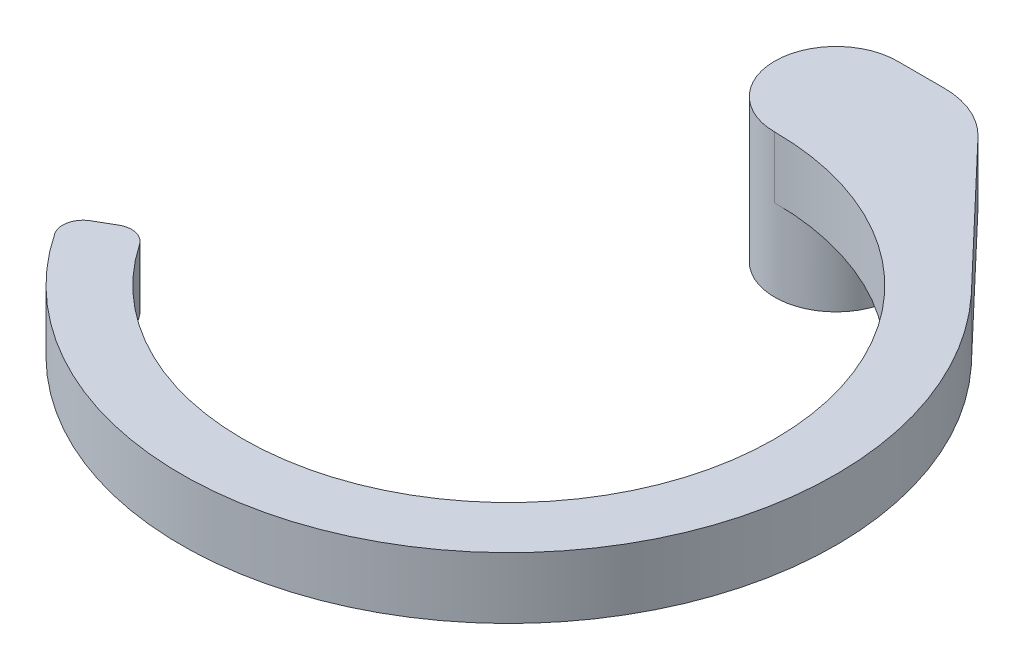
ISO-10303-21;
HEADER;
FILE_DESCRIPTION(('STEP AP214'),'2;1');
FILE_NAME('part.step','',(''),(''),'','','');
FILE_SCHEMA(('AUTOMOTIVE_DESIGN { 1 0 10303 214 1 1 1 1 }'));
ENDSEC;
DATA;
#1=APPLICATION_CONTEXT('core data for automotive mechanical design processes');
#2=APPLICATION_PROTOCOL_DEFINITION('international standard','automotive_design',2000,#1);
#3=PRODUCT_CONTEXT('',#1,'mechanical');
#4=PRODUCT('Part','Part','',(#3));
#5=PRODUCT_RELATED_PRODUCT_CATEGORY('part','',(#4));
#6=PRODUCT_DEFINITION_FORMATION('','',#4);
#7=PRODUCT_DEFINITION_CONTEXT('part definition',#1,'design');
#8=PRODUCT_DEFINITION('design','',#6,#7);
#9=PRODUCT_DEFINITION_SHAPE('','',#8);
#10=(LENGTH_UNIT() NAMED_UNIT(*) SI_UNIT(.MILLI.,.METRE.));
#11=(NAMED_UNIT(*) PLANE_ANGLE_UNIT() SI_UNIT($,.RADIAN.));
#12=(NAMED_UNIT(*) SI_UNIT($,.STERADIAN.) SOLID_ANGLE_UNIT());
#13=UNCERTAINTY_MEASURE_WITH_UNIT(LENGTH_MEASURE(1.E-05),#10,'distance_accuracy_value','');
#14=(GEOMETRIC_REPRESENTATION_CONTEXT(3) GLOBAL_UNCERTAINTY_ASSIGNED_CONTEXT((#13)) GLOBAL_UNIT_ASSIGNED_CONTEXT((#10,
#11,#12)) REPRESENTATION_CONTEXT('',''));
#15=CARTESIAN_POINT('',(0.,0.,0.));
#16=DIRECTION('',(0.,0.,1.));
#17=DIRECTION('',(1.,0.,0.));
#18=AXIS2_PLACEMENT_3D('',#15,#16,#17);
#19=CARTESIAN_POINT('',(0.,0.,0.));
#20=DIRECTION('',(0.,1.,0.));
#21=DIRECTION('',(0.,0.,1.));
#22=AXIS2_PLACEMENT_3D('',#19,#20,#21);
#23=PLANE('',#22);
#24=CARTESIAN_POINT('',(0.,0.,-80.));
#25=DIRECTION('',(0.,-1.,0.));
#26=DIRECTION('',(0.,0.,-1.));
#27=AXIS2_PLACEMENT_3D('',#24,#25,#26);
#28=CIRCLE('',#27,15.);
#29=CARTESIAN_POINT('',(0.,0.,-95.));
#30=VERTEX_POINT('',#29);
#31=CARTESIAN_POINT('',(0.,0.,-65.));
#32=VERTEX_POINT('',#31);
#33=EDGE_CURVE('E169',#30,#32,#28,.T.);
#34=ORIENTED_EDGE('',*,*,#33,.F.);
#35=DIRECTION('',(1.,0.,0.));
#36=VECTOR('',#35,1.);
#37=CARTESIAN_POINT('',(-1.15370923512719E-13,0.,-95.));
#38=LINE('',#37,#36);
#39=CARTESIAN_POINT('',(11.4274013035618,0.,-95.));
#40=VERTEX_POINT('',#39);
#41=EDGE_CURVE('E152',#30,#40,#38,.T.);
#42=ORIENTED_EDGE('',*,*,#41,.T.);
#43=CARTESIAN_POINT('',(11.4274013035615,0.,-75.));
#44=DIRECTION('',(0.,1.,0.));
#45=DIRECTION('',(0.,0.,1.));
#46=AXIS2_PLACEMENT_3D('',#43,#44,#45);
#47=CIRCLE('',#46,20.0000000000001);
#48=CARTESIAN_POINT('',(25.911523347206,0.,-88.7916717124799));
#49=VERTEX_POINT('',#48);
#50=EDGE_CURVE('E149',#40,#49,#47,.F.);
#51=ORIENTED_EDGE('',*,*,#50,.T.);
#52=DIRECTION('',(0.689583585623996,0.,0.724206102182212));
#53=VECTOR('',#52,1.);
#54=CARTESIAN_POINT('',(57.9325504327501,0.,-55.1629373618664));
#55=LINE('',#54,#53);
#56=CARTESIAN_POINT('',(58.5757297296054,0.,-54.4874654085159));
#57=VERTEX_POINT('',#56);
#58=EDGE_CURVE('E146',#49,#57,#55,.T.);
#59=ORIENTED_EDGE('',*,*,#58,.T.);
#60=CARTESIAN_POINT('',(0.,0.,0.));
#61=DIRECTION('',(0.,1.,0.));
#62=DIRECTION('',(0.,0.,1.));
#63=AXIS2_PLACEMENT_3D('',#60,#61,#62);
#64=CIRCLE('',#63,80.);
#65=CARTESIAN_POINT('',(-66.4612341163506,0.,44.5298142791056));
#66=VERTEX_POINT('',#65);
#67=EDGE_CURVE('E142',#66,#57,#64,.T.);
#68=ORIENTED_EDGE('',*,*,#67,.F.);
#69=CARTESIAN_POINT('',(-62.3074069840787,0.,41.7467008866615));
#70=DIRECTION('',(0.,1.,0.));
#71=DIRECTION('',(0.,0.,1.));
#72=AXIS2_PLACEMENT_3D('',#69,#70,#71);
#73=CIRCLE('',#72,5.00000000000001);
#74=CARTESIAN_POINT('',(-64.8074069840787,0.,37.4165738677393));
#75=VERTEX_POINT('',#74);
#76=EDGE_CURVE('E139',#66,#75,#73,.F.);
#77=ORIENTED_EDGE('',*,*,#76,.T.);
#78=DIRECTION('',(-0.86602540378444,0.,0.499999999999997));
#79=VECTOR('',#78,1.);
#80=CARTESIAN_POINT('',(0.,0.,0.));
#81=LINE('',#80,#79);
#82=CARTESIAN_POINT('',(-60.4669331122392,0.,34.9106001094222));
#83=VERTEX_POINT('',#82);
#84=EDGE_CURVE('E154',#83,#75,#81,.T.);
#85=ORIENTED_EDGE('',*,*,#84,.F.);
#86=CARTESIAN_POINT('',(-57.9669331122392,0.,39.2407271283444));
#87=DIRECTION('',(0.,1.,0.));
#88=DIRECTION('',(0.,0.,1.));
#89=AXIS2_PLACEMENT_3D('',#86,#87,#88);
#90=CIRCLE('',#89,5.);
#91=CARTESIAN_POINT('',(-53.8264378899364,0.,36.4378180477484));
#92=VERTEX_POINT('',#91);
#93=EDGE_CURVE('E82',#92,#83,#90,.T.);
#94=ORIENTED_EDGE('',*,*,#93,.F.);
#95=CARTESIAN_POINT('',(0.,0.,0.));
#96=DIRECTION('',(0.,1.,0.));
#97=DIRECTION('',(0.,0.,1.));
#98=AXIS2_PLACEMENT_3D('',#95,#96,#97);
#99=CIRCLE('',#98,65.);
#100=EDGE_CURVE('E121',#92,#32,#99,.T.);
#101=ORIENTED_EDGE('',*,*,#100,.T.);
#102=EDGE_LOOP('',(#34,#42,#51,#59,#68,#77,#85,#94,#101));
#103=FACE_BOUND('',#102,.T.);
#104=ADVANCED_FACE('F35',(#103),#23,.F.);
#105=CARTESIAN_POINT('',(-62.3074069840787,15.,41.7467008866615));
#106=DIRECTION('',(0.,-1.,0.));
#107=DIRECTION('',(0.,0.,-1.));
#108=AXIS2_PLACEMENT_3D('',#105,#106,#107);
#109=CYLINDRICAL_SURFACE('',#108,5.00000000000001);
#110=ORIENTED_EDGE('',*,*,#76,.F.);
#111=DIRECTION('',(0.,-1.,0.));
#112=VECTOR('',#111,1.);
#113=CARTESIAN_POINT('',(-66.4612341163506,15.,44.5298142791056));
#114=LINE('',#113,#112);
#115=CARTESIAN_POINT('',(-66.4612341163506,15.,44.5298142791056));
#116=VERTEX_POINT('',#115);
#117=EDGE_CURVE('E11',#116,#66,#114,.T.);
#118=ORIENTED_EDGE('',*,*,#117,.F.);
#119=CARTESIAN_POINT('',(-62.3074069840787,15.,41.7467008866615));
#120=DIRECTION('',(0.,1.,0.));
#121=DIRECTION('',(0.,0.,1.));
#122=AXIS2_PLACEMENT_3D('',#119,#120,#121);
#123=CIRCLE('',#122,5.00000000000001);
#124=CARTESIAN_POINT('',(-64.8074069840787,15.,37.4165738677393));
#125=VERTEX_POINT('',#124);
#126=EDGE_CURVE('E156',#116,#125,#123,.F.);
#127=ORIENTED_EDGE('',*,*,#126,.T.);
#128=DIRECTION('',(0.,-1.,0.));
#129=VECTOR('',#128,1.);
#130=CARTESIAN_POINT('',(-64.8074069840787,15.,37.4165738677393));
#131=LINE('',#130,#129);
#132=EDGE_CURVE('E89',#125,#75,#131,.T.);
#133=ORIENTED_EDGE('',*,*,#132,.T.);
#134=EDGE_LOOP('',(#110,#118,#127,#133));
#135=FACE_BOUND('',#134,.T.);
#136=ADVANCED_FACE('F37',(#135),#109,.T.);
#137=CARTESIAN_POINT('',(0.,15.,0.));
#138=DIRECTION('',(0.,-1.,0.));
#139=DIRECTION('',(0.,0.,-1.));
#140=AXIS2_PLACEMENT_3D('',#137,#138,#139);
#141=CYLINDRICAL_SURFACE('',#140,80.);
#142=ORIENTED_EDGE('',*,*,#67,.T.);
#143=DIRECTION('',(0.,-1.,0.));
#144=VECTOR('',#143,1.);
#145=CARTESIAN_POINT('',(58.5757297296054,15.,-54.4874654085159));
#146=LINE('',#145,#144);
#147=CARTESIAN_POINT('',(58.5757297296054,15.,-54.4874654085159));
#148=VERTEX_POINT('',#147);
#149=EDGE_CURVE('E45',#148,#57,#146,.T.);
#150=ORIENTED_EDGE('',*,*,#149,.F.);
#151=CARTESIAN_POINT('',(0.,15.,0.));
#152=DIRECTION('',(0.,1.,0.));
#153=DIRECTION('',(0.,0.,1.));
#154=AXIS2_PLACEMENT_3D('',#151,#152,#153);
#155=CIRCLE('',#154,80.);
#156=EDGE_CURVE('E175',#116,#148,#155,.T.);
#157=ORIENTED_EDGE('',*,*,#156,.F.);
#158=ORIENTED_EDGE('',*,*,#117,.T.);
#159=EDGE_LOOP('',(#142,#150,#157,#158));
#160=FACE_BOUND('',#159,.T.);
#161=ADVANCED_FACE('F210',(#160),#141,.T.);
#162=CARTESIAN_POINT('',(57.9325504327501,15.,-55.1629373618664));
#163=DIRECTION('',(0.724206102182212,0.,-0.689583585623996));
#164=DIRECTION('',(-0.689583585623996,0.,-0.724206102182212));
#165=AXIS2_PLACEMENT_3D('',#162,#163,#164);
#166=PLANE('',#165);
#167=ORIENTED_EDGE('',*,*,#58,.F.);
#168=DIRECTION('',(0.,-1.,0.));
#169=VECTOR('',#168,1.);
#170=CARTESIAN_POINT('',(25.911523347206,15.,-88.7916717124799));
#171=LINE('',#170,#169);
#172=CARTESIAN_POINT('',(25.911523347206,15.,-88.7916717124799));
#173=VERTEX_POINT('',#172);
#174=EDGE_CURVE('E161',#173,#49,#171,.T.);
#175=ORIENTED_EDGE('',*,*,#174,.F.);
#176=DIRECTION('',(0.689583585623996,0.,0.724206102182212));
#177=VECTOR('',#176,1.);
#178=CARTESIAN_POINT('',(57.9325504327501,15.,-55.1629373618664));
#179=LINE('',#178,#177);
#180=EDGE_CURVE('E177',#173,#148,#179,.T.);
#181=ORIENTED_EDGE('',*,*,#180,.T.);
#182=ORIENTED_EDGE('',*,*,#149,.T.);
#183=EDGE_LOOP('',(#167,#175,#181,#182));
#184=FACE_BOUND('',#183,.T.);
#185=ADVANCED_FACE('F212',(#184),#166,.T.);
#186=CARTESIAN_POINT('',(11.4274013035615,15.,-75.));
#187=DIRECTION('',(0.,-1.,0.));
#188=DIRECTION('',(0.,0.,-1.));
#189=AXIS2_PLACEMENT_3D('',#186,#187,#188);
#190=CYLINDRICAL_SURFACE('',#189,20.0000000000001);
#191=ORIENTED_EDGE('',*,*,#50,.F.);
#192=DIRECTION('',(0.,-1.,0.));
#193=VECTOR('',#192,1.);
#194=CARTESIAN_POINT('',(11.4274013035618,15.,-95.));
#195=LINE('',#194,#193);
#196=CARTESIAN_POINT('',(11.4274013035618,15.,-95.));
#197=VERTEX_POINT('',#196);
#198=EDGE_CURVE('E159',#197,#40,#195,.T.);
#199=ORIENTED_EDGE('',*,*,#198,.F.);
#200=CARTESIAN_POINT('',(11.4274013035615,15.,-75.));
#201=DIRECTION('',(0.,1.,0.));
#202=DIRECTION('',(0.,0.,1.));
#203=AXIS2_PLACEMENT_3D('',#200,#201,#202);
#204=CIRCLE('',#203,20.0000000000001);
#205=EDGE_CURVE('E180',#197,#173,#204,.F.);
#206=ORIENTED_EDGE('',*,*,#205,.T.);
#207=ORIENTED_EDGE('',*,*,#174,.T.);
#208=EDGE_LOOP('',(#191,#199,#206,#207));
#209=FACE_BOUND('',#208,.T.);
#210=ADVANCED_FACE('F191',(#209),#190,.T.);
#211=CARTESIAN_POINT('',(-1.15370923512719E-13,15.,-95.));
#212=DIRECTION('',(0.,0.,-1.));
#213=DIRECTION('',(-1.,0.,0.));
#214=AXIS2_PLACEMENT_3D('',#211,#212,#213);
#215=PLANE('',#214);
#216=ORIENTED_EDGE('',*,*,#41,.F.);
#217=DIRECTION('',(0.,-1.,0.));
#218=VECTOR('',#217,1.);
#219=CARTESIAN_POINT('',(0.,15.,-95.));
#220=LINE('',#219,#218);
#221=CARTESIAN_POINT('',(0.,15.,-95.));
#222=VERTEX_POINT('',#221);
#223=EDGE_CURVE('E162',#222,#30,#220,.T.);
#224=ORIENTED_EDGE('',*,*,#223,.F.);
#225=DIRECTION('',(1.,0.,0.));
#226=VECTOR('',#225,1.);
#227=CARTESIAN_POINT('',(-1.15370923512719E-13,15.,-95.));
#228=LINE('',#227,#226);
#229=EDGE_CURVE('E134',#222,#197,#228,.T.);
#230=ORIENTED_EDGE('',*,*,#229,.T.);
#231=ORIENTED_EDGE('',*,*,#198,.T.);
#232=EDGE_LOOP('',(#216,#224,#230,#231));
#233=FACE_BOUND('',#232,.T.);
#234=ADVANCED_FACE('F185',(#233),#215,.T.);
#235=CARTESIAN_POINT('',(0.,15.,-80.));
#236=DIRECTION('',(0.,-1.,0.));
#237=DIRECTION('',(0.,0.,-1.));
#238=AXIS2_PLACEMENT_3D('',#235,#236,#237);
#239=CYLINDRICAL_SURFACE('',#238,15.);
#240=ORIENTED_EDGE('',*,*,#223,.T.);
#241=ORIENTED_EDGE('',*,*,#33,.T.);
#242=DIRECTION('',(0.,-1.,0.));
#243=VECTOR('',#242,1.);
#244=CARTESIAN_POINT('',(0.,15.,-65.));
#245=LINE('',#244,#243);
#246=CARTESIAN_POINT('',(0.,15.,-65.));
#247=VERTEX_POINT('',#246);
#248=EDGE_CURVE('E122',#247,#32,#245,.T.);
#249=ORIENTED_EDGE('',*,*,#248,.F.);
#250=CARTESIAN_POINT('',(0.,15.,-80.));
#251=DIRECTION('',(0.,1.,0.));
#252=DIRECTION('',(0.,0.,1.));
#253=AXIS2_PLACEMENT_3D('',#250,#251,#252);
#254=CIRCLE('',#253,15.);
#255=EDGE_CURVE('E131',#222,#247,#254,.T.);
#256=ORIENTED_EDGE('',*,*,#255,.F.);
#257=EDGE_LOOP('',(#240,#241,#249,#256));
#258=FACE_BOUND('',#257,.T.);
#259=CARTESIAN_POINT('',(0.,-20.,-80.));
#260=DIRECTION('',(0.,-1.,0.));
#261=DIRECTION('',(0.,0.,-1.));
#262=AXIS2_PLACEMENT_3D('',#259,#260,#261);
#263=CIRCLE('',#262,15.);
#264=CARTESIAN_POINT('',(0.,-20.,-95.));
#265=VERTEX_POINT('',#264);
#266=EDGE_CURVE('E143',#265,#265,#263,.T.);
#267=ORIENTED_EDGE('',*,*,#266,.F.);
#268=EDGE_LOOP('',(#267));
#269=FACE_BOUND('',#268,.T.);
#270=ADVANCED_FACE('F234',(#258,#269),#239,.T.);
#271=CARTESIAN_POINT('',(0.,15.,0.));
#272=DIRECTION('',(0.,-1.,0.));
#273=DIRECTION('',(0.,0.,-1.));
#274=AXIS2_PLACEMENT_3D('',#271,#272,#273);
#275=CYLINDRICAL_SURFACE('',#274,65.);
#276=ORIENTED_EDGE('',*,*,#100,.F.);
#277=DIRECTION('',(0.,-1.,0.));
#278=VECTOR('',#277,1.);
#279=CARTESIAN_POINT('',(-53.8264378899364,15.,36.4378180477484));
#280=LINE('',#279,#278);
#281=CARTESIAN_POINT('',(-53.8264378899364,15.,36.4378180477484));
#282=VERTEX_POINT('',#281);
#283=EDGE_CURVE('E114',#282,#92,#280,.T.);
#284=ORIENTED_EDGE('',*,*,#283,.F.);
#285=CARTESIAN_POINT('',(0.,15.,0.));
#286=DIRECTION('',(0.,1.,0.));
#287=DIRECTION('',(0.,0.,1.));
#288=AXIS2_PLACEMENT_3D('',#285,#286,#287);
#289=CIRCLE('',#288,65.);
#290=EDGE_CURVE('E119',#282,#247,#289,.T.);
#291=ORIENTED_EDGE('',*,*,#290,.T.);
#292=ORIENTED_EDGE('',*,*,#248,.T.);
#293=EDGE_LOOP('',(#276,#284,#291,#292));
#294=FACE_BOUND('',#293,.T.);
#295=ADVANCED_FACE('F116',(#294),#275,.F.);
#296=CARTESIAN_POINT('',(-57.9669331122392,15.,39.2407271283444));
#297=DIRECTION('',(0.,-1.,0.));
#298=DIRECTION('',(0.,0.,-1.));
#299=AXIS2_PLACEMENT_3D('',#296,#297,#298);
#300=CYLINDRICAL_SURFACE('',#299,5.);
#301=ORIENTED_EDGE('',*,*,#93,.T.);
#302=DIRECTION('',(0.,-1.,0.));
#303=VECTOR('',#302,1.);
#304=CARTESIAN_POINT('',(-60.4669331122392,15.,34.9106001094222));
#305=LINE('',#304,#303);
#306=CARTESIAN_POINT('',(-60.4669331122392,15.,34.9106001094222));
#307=VERTEX_POINT('',#306);
#308=EDGE_CURVE('E123',#307,#83,#305,.T.);
#309=ORIENTED_EDGE('',*,*,#308,.F.);
#310=CARTESIAN_POINT('',(-57.9669331122392,15.,39.2407271283444));
#311=DIRECTION('',(0.,1.,0.));
#312=DIRECTION('',(0.,0.,1.));
#313=AXIS2_PLACEMENT_3D('',#310,#311,#312);
#314=CIRCLE('',#313,5.);
#315=EDGE_CURVE('E125',#282,#307,#314,.T.);
#316=ORIENTED_EDGE('',*,*,#315,.F.);
#317=ORIENTED_EDGE('',*,*,#283,.T.);
#318=EDGE_LOOP('',(#301,#309,#316,#317));
#319=FACE_BOUND('',#318,.T.);
#320=ADVANCED_FACE('F126',(#319),#300,.T.);
#321=CARTESIAN_POINT('',(0.,15.,0.));
#322=DIRECTION('',(0.499999999999997,0.,0.86602540378444));
#323=DIRECTION('',(0.86602540378444,0.,-0.499999999999997));
#324=AXIS2_PLACEMENT_3D('',#321,#322,#323);
#325=PLANE('',#324);
#326=ORIENTED_EDGE('',*,*,#84,.T.);
#327=ORIENTED_EDGE('',*,*,#132,.F.);
#328=DIRECTION('',(-0.86602540378444,0.,0.499999999999997));
#329=VECTOR('',#328,1.);
#330=CARTESIAN_POINT('',(0.,15.,0.));
#331=LINE('',#330,#329);
#332=EDGE_CURVE('E54',#307,#125,#331,.T.);
#333=ORIENTED_EDGE('',*,*,#332,.F.);
#334=ORIENTED_EDGE('',*,*,#308,.T.);
#335=EDGE_LOOP('',(#326,#327,#333,#334));
#336=FACE_BOUND('',#335,.T.);
#337=ADVANCED_FACE('F207',(#336),#325,.F.);
#338=CARTESIAN_POINT('',(0.,15.,0.));
#339=DIRECTION('',(0.,1.,0.));
#340=DIRECTION('',(0.,0.,1.));
#341=AXIS2_PLACEMENT_3D('',#338,#339,#340);
#342=PLANE('',#341);
#343=ORIENTED_EDGE('',*,*,#126,.F.);
#344=ORIENTED_EDGE('',*,*,#156,.T.);
#345=ORIENTED_EDGE('',*,*,#180,.F.);
#346=ORIENTED_EDGE('',*,*,#205,.F.);
#347=ORIENTED_EDGE('',*,*,#229,.F.);
#348=ORIENTED_EDGE('',*,*,#255,.T.);
#349=ORIENTED_EDGE('',*,*,#290,.F.);
#350=ORIENTED_EDGE('',*,*,#315,.T.);
#351=ORIENTED_EDGE('',*,*,#332,.T.);
#352=EDGE_LOOP('',(#343,#344,#345,#346,#347,#348,#349,#350,#351));
#353=FACE_BOUND('',#352,.T.);
#354=ADVANCED_FACE('F128',(#353),#342,.T.);
#355=CARTESIAN_POINT('',(0.,-20.,-80.));
#356=DIRECTION('',(0.,-1.,0.));
#357=DIRECTION('',(0.,0.,-1.));
#358=AXIS2_PLACEMENT_3D('',#355,#356,#357);
#359=PLANE('',#358);
#360=CARTESIAN_POINT('',(0.,-20.,-80.));
#361=DIRECTION('',(0.,-1.,0.));
#362=DIRECTION('',(0.,0.,-1.));
#363=AXIS2_PLACEMENT_3D('',#360,#361,#362);
#364=CIRCLE('',#363,10.1);
#365=CARTESIAN_POINT('',(0.,-20.,-90.1));
#366=VERTEX_POINT('',#365);
#367=EDGE_CURVE('E335',#366,#366,#364,.T.);
#368=ORIENTED_EDGE('',*,*,#367,.F.);
#369=EDGE_LOOP('',(#368));
#370=FACE_BOUND('',#369,.T.);
#371=ORIENTED_EDGE('',*,*,#266,.T.);
#372=EDGE_LOOP('',(#371));
#373=FACE_BOUND('',#372,.T.);
#374=ADVANCED_FACE('F265',(#370,#373),#359,.T.);
#375=CARTESIAN_POINT('',(0.,-18.,-80.));
#376=DIRECTION('',(0.,-1.,0.));
#377=DIRECTION('',(0.,0.,-1.));
#378=AXIS2_PLACEMENT_3D('',#375,#376,#377);
#379=CYLINDRICAL_SURFACE('',#378,10.1);
#380=CARTESIAN_POINT('',(0.,-18.,-80.));
#381=DIRECTION('',(0.,-1.,0.));
#382=DIRECTION('',(0.,0.,-1.));
#383=AXIS2_PLACEMENT_3D('',#380,#381,#382);
#384=CIRCLE('',#383,10.1);
#385=CARTESIAN_POINT('',(0.,-18.,-90.1));
#386=VERTEX_POINT('',#385);
#387=EDGE_CURVE('E172',#386,#386,#384,.T.);
#388=ORIENTED_EDGE('',*,*,#387,.F.);
#389=EDGE_LOOP('',(#388));
#390=FACE_BOUND('',#389,.T.);
#391=ORIENTED_EDGE('',*,*,#367,.T.);
#392=EDGE_LOOP('',(#391));
#393=FACE_BOUND('',#392,.T.);
#394=ADVANCED_FACE('F270',(#390,#393),#379,.F.);
#395=CARTESIAN_POINT('',(0.,-18.,-80.));
#396=DIRECTION('',(0.,-1.,0.));
#397=DIRECTION('',(0.,0.,-1.));
#398=AXIS2_PLACEMENT_3D('',#395,#396,#397);
#399=PLANE('',#398);
#400=ORIENTED_EDGE('',*,*,#387,.T.);
#401=EDGE_LOOP('',(#400));
#402=FACE_BOUND('',#401,.T.);
#403=ADVANCED_FACE('F277',(#402),#399,.T.);
#404=CLOSED_SHELL('',(#104,#136,#161,#185,#210,#234,#270,#295,#320,#337,#354,#374,#394,#403));
#405=MANIFOLD_SOLID_BREP('B2',#404);
#406=ADVANCED_BREP_SHAPE_REPRESENTATION('',(#18,#405),#14);
#407=SHAPE_DEFINITION_REPRESENTATION(#9,#406);
ENDSEC;
END-ISO-10303-21;
